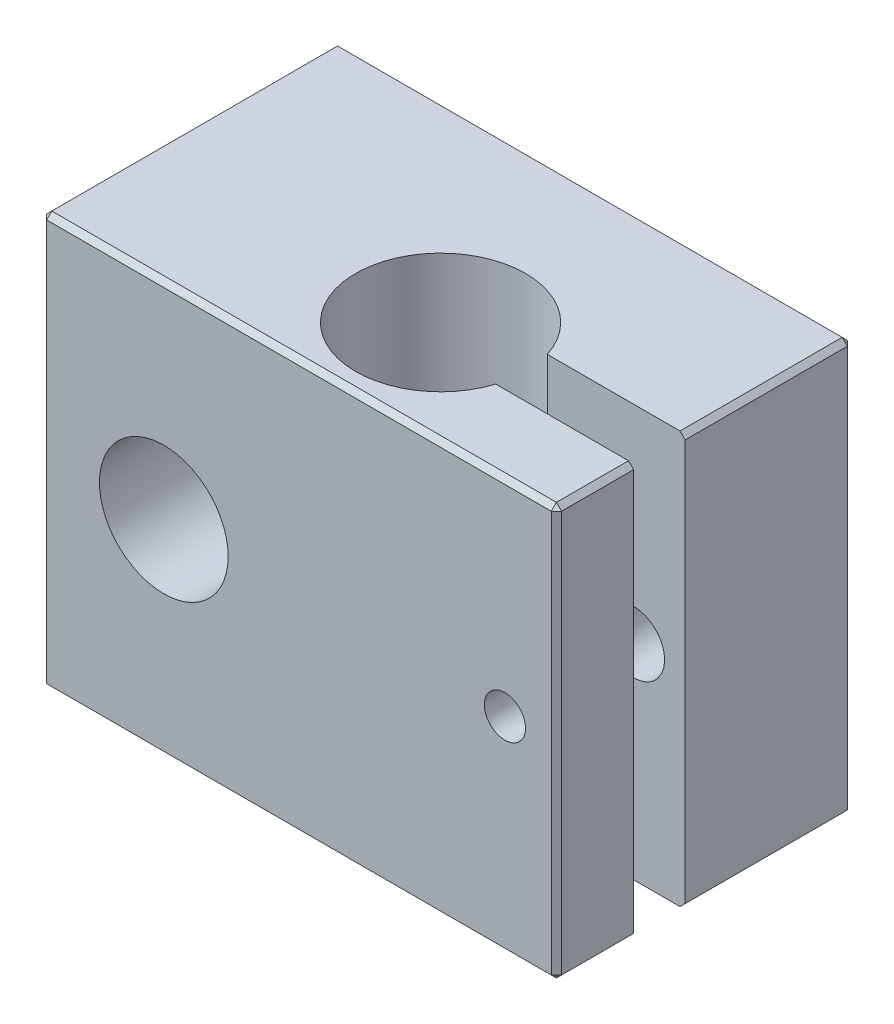
ISO-10303-21;
HEADER;
FILE_DESCRIPTION(('STEP AP214'),'2;1');
FILE_NAME('part.step','',(''),(''),'','','');
FILE_SCHEMA(('AUTOMOTIVE_DESIGN { 1 0 10303 214 1 1 1 1 }'));
ENDSEC;
DATA;
#1=APPLICATION_CONTEXT('core data for automotive mechanical design processes');
#2=APPLICATION_PROTOCOL_DEFINITION('international standard','automotive_design',2000,#1);
#3=PRODUCT_CONTEXT('',#1,'mechanical');
#4=PRODUCT('Part','Part','',(#3));
#5=PRODUCT_RELATED_PRODUCT_CATEGORY('part','',(#4));
#6=PRODUCT_DEFINITION_FORMATION('','',#4);
#7=PRODUCT_DEFINITION_CONTEXT('part definition',#1,'design');
#8=PRODUCT_DEFINITION('design','',#6,#7);
#9=PRODUCT_DEFINITION_SHAPE('','',#8);
#10=(LENGTH_UNIT() NAMED_UNIT(*) SI_UNIT(.MILLI.,.METRE.));
#11=(NAMED_UNIT(*) PLANE_ANGLE_UNIT() SI_UNIT($,.RADIAN.));
#12=(NAMED_UNIT(*) SI_UNIT($,.STERADIAN.) SOLID_ANGLE_UNIT());
#13=UNCERTAINTY_MEASURE_WITH_UNIT(LENGTH_MEASURE(1.E-05),#10,'distance_accuracy_value','');
#14=(GEOMETRIC_REPRESENTATION_CONTEXT(3) GLOBAL_UNCERTAINTY_ASSIGNED_CONTEXT((#13)) GLOBAL_UNIT_ASSIGNED_CONTEXT((#10,
#11,#12)) REPRESENTATION_CONTEXT('',''));
#15=CARTESIAN_POINT('',(0.,0.,0.));
#16=DIRECTION('',(0.,0.,1.));
#17=DIRECTION('',(1.,0.,0.));
#18=AXIS2_PLACEMENT_3D('',#15,#16,#17);
#19=CARTESIAN_POINT('',(0.,0.,0.));
#20=DIRECTION('',(0.,0.,1.));
#21=DIRECTION('',(1.,0.,0.));
#22=AXIS2_PLACEMENT_3D('',#19,#20,#21);
#23=PLANE('',#22);
#24=DIRECTION('',(0.,-1.,0.));
#25=VECTOR('',#24,1.);
#26=CARTESIAN_POINT('',(15.05,0.,0.));
#27=LINE('',#26,#25);
#28=CARTESIAN_POINT('',(15.05,7.8,0.));
#29=VERTEX_POINT('',#28);
#30=CARTESIAN_POINT('',(15.05,-7.8,0.));
#31=VERTEX_POINT('',#30);
#32=EDGE_CURVE('E239',#29,#31,#27,.T.);
#33=ORIENTED_EDGE('',*,*,#32,.T.);
#34=DIRECTION('',(-1.,0.,0.));
#35=VECTOR('',#34,1.);
#36=CARTESIAN_POINT('',(0.,-7.8,0.));
#37=LINE('',#36,#35);
#38=CARTESIAN_POINT('',(-4.55,-7.8,0.));
#39=VERTEX_POINT('',#38);
#40=EDGE_CURVE('E243',#31,#39,#37,.T.);
#41=ORIENTED_EDGE('',*,*,#40,.T.);
#42=DIRECTION('',(0.,1.,0.));
#43=VECTOR('',#42,1.);
#44=CARTESIAN_POINT('',(-4.55,0.,0.));
#45=LINE('',#44,#43);
#46=CARTESIAN_POINT('',(-4.55,7.8,0.));
#47=VERTEX_POINT('',#46);
#48=EDGE_CURVE('E241',#39,#47,#45,.T.);
#49=ORIENTED_EDGE('',*,*,#48,.T.);
#50=DIRECTION('',(1.,0.,0.));
#51=VECTOR('',#50,1.);
#52=CARTESIAN_POINT('',(0.,7.8,0.));
#53=LINE('',#52,#51);
#54=EDGE_CURVE('E237',#47,#29,#53,.T.);
#55=ORIENTED_EDGE('',*,*,#54,.T.);
#56=EDGE_LOOP('',(#33,#41,#49,#55));
#57=FACE_BOUND('',#56,.T.);
#58=CARTESIAN_POINT('',(0.,0.,0.));
#59=DIRECTION('',(0.,0.,1.));
#60=DIRECTION('',(1.,0.,0.));
#61=AXIS2_PLACEMENT_3D('',#58,#59,#60);
#62=CIRCLE('',#61,2.5);
#63=CARTESIAN_POINT('',(2.5,0.,0.));
#64=VERTEX_POINT('',#63);
#65=EDGE_CURVE('E179',#64,#64,#62,.T.);
#66=ORIENTED_EDGE('',*,*,#65,.T.);
#67=EDGE_LOOP('',(#66));
#68=FACE_BOUND('',#67,.T.);
#69=CARTESIAN_POINT('',(13.25,0.,0.));
#70=DIRECTION('',(0.,0.,-1.));
#71=DIRECTION('',(-1.,0.,0.));
#72=AXIS2_PLACEMENT_3D('',#69,#70,#71);
#73=CIRCLE('',#72,1.19999999999999);
#74=CARTESIAN_POINT('',(12.05,0.,0.));
#75=VERTEX_POINT('',#74);
#76=EDGE_CURVE('E355',#75,#75,#73,.T.);
#77=ORIENTED_EDGE('',*,*,#76,.F.);
#78=EDGE_LOOP('',(#77));
#79=FACE_BOUND('',#78,.T.);
#80=ADVANCED_FACE('F36',(#57,#68,#79),#23,.F.);
#81=CARTESIAN_POINT('',(15.25,8.,11.5));
#82=DIRECTION('',(-1.,0.,0.));
#83=DIRECTION('',(0.,-1.,0.));
#84=AXIS2_PLACEMENT_3D('',#81,#82,#83);
#85=PLANE('',#84);
#86=DIRECTION('',(0.,-1.,0.));
#87=VECTOR('',#86,1.);
#88=CARTESIAN_POINT('',(15.25,-8.,11.3));
#89=LINE('',#88,#87);
#90=CARTESIAN_POINT('',(15.25,7.8,11.3));
#91=VERTEX_POINT('',#90);
#92=CARTESIAN_POINT('',(15.25,-7.8,11.3));
#93=VERTEX_POINT('',#92);
#94=EDGE_CURVE('E275',#91,#93,#89,.T.);
#95=ORIENTED_EDGE('',*,*,#94,.T.);
#96=DIRECTION('',(0.,0.,-1.));
#97=VECTOR('',#96,1.);
#98=CARTESIAN_POINT('',(15.25,-7.8,11.5));
#99=LINE('',#98,#97);
#100=CARTESIAN_POINT('',(15.25,-7.8,8.5));
#101=VERTEX_POINT('',#100);
#102=EDGE_CURVE('E279',#93,#101,#99,.T.);
#103=ORIENTED_EDGE('',*,*,#102,.T.);
#104=DIRECTION('',(0.,1.,0.));
#105=VECTOR('',#104,1.);
#106=CARTESIAN_POINT('',(15.25,8.,8.5));
#107=LINE('',#106,#105);
#108=CARTESIAN_POINT('',(15.25,7.8,8.5));
#109=VERTEX_POINT('',#108);
#110=EDGE_CURVE('E196',#101,#109,#107,.T.);
#111=ORIENTED_EDGE('',*,*,#110,.T.);
#112=DIRECTION('',(0.,0.,1.));
#113=VECTOR('',#112,1.);
#114=CARTESIAN_POINT('',(15.25,7.8,11.5));
#115=LINE('',#114,#113);
#116=EDGE_CURVE('E277',#109,#91,#115,.T.);
#117=ORIENTED_EDGE('',*,*,#116,.T.);
#118=EDGE_LOOP('',(#95,#103,#111,#117));
#119=FACE_BOUND('',#118,.T.);
#120=ADVANCED_FACE('F485',(#119),#85,.F.);
#121=CARTESIAN_POINT('',(-4.75,8.,11.5));
#122=DIRECTION('',(1.,0.,0.));
#123=DIRECTION('',(0.,1.,0.));
#124=AXIS2_PLACEMENT_3D('',#121,#122,#123);
#125=PLANE('',#124);
#126=DIRECTION('',(0.,-1.,0.));
#127=VECTOR('',#126,1.);
#128=CARTESIAN_POINT('',(-4.75,8.,0.200000000000002));
#129=LINE('',#128,#127);
#130=CARTESIAN_POINT('',(-4.75,7.8,0.200000000000002));
#131=VERTEX_POINT('',#130);
#132=CARTESIAN_POINT('',(-4.75,-7.8,0.200000000000002));
#133=VERTEX_POINT('',#132);
#134=EDGE_CURVE('E250',#131,#133,#129,.T.);
#135=ORIENTED_EDGE('',*,*,#134,.T.);
#136=DIRECTION('',(0.,0.,1.));
#137=VECTOR('',#136,1.);
#138=CARTESIAN_POINT('',(-4.75,-7.8,11.5));
#139=LINE('',#138,#137);
#140=CARTESIAN_POINT('',(-4.75,-7.8,11.3));
#141=VERTEX_POINT('',#140);
#142=EDGE_CURVE('E252',#133,#141,#139,.T.);
#143=ORIENTED_EDGE('',*,*,#142,.T.);
#144=DIRECTION('',(0.,1.,0.));
#145=VECTOR('',#144,1.);
#146=CARTESIAN_POINT('',(-4.75,8.,11.3));
#147=LINE('',#146,#145);
#148=CARTESIAN_POINT('',(-4.75,7.8,11.3));
#149=VERTEX_POINT('',#148);
#150=EDGE_CURVE('E246',#141,#149,#147,.T.);
#151=ORIENTED_EDGE('',*,*,#150,.T.);
#152=DIRECTION('',(0.,0.,-1.));
#153=VECTOR('',#152,1.);
#154=CARTESIAN_POINT('',(-4.75,7.8,11.5));
#155=LINE('',#154,#153);
#156=EDGE_CURVE('E248',#149,#131,#155,.T.);
#157=ORIENTED_EDGE('',*,*,#156,.T.);
#158=EDGE_LOOP('',(#135,#143,#151,#157));
#159=FACE_BOUND('',#158,.T.);
#160=ADVANCED_FACE('F490',(#159),#125,.F.);
#161=CARTESIAN_POINT('',(-4.75,-8.,11.5));
#162=DIRECTION('',(0.,1.,0.));
#163=DIRECTION('',(0.,0.,1.));
#164=AXIS2_PLACEMENT_3D('',#161,#162,#163);
#165=PLANE('',#164);
#166=CARTESIAN_POINT('',(-1.25,-8.,6.5));
#167=DIRECTION('',(0.,-1.,0.));
#168=DIRECTION('',(0.,0.,-1.));
#169=AXIS2_PLACEMENT_3D('',#166,#167,#168);
#170=CIRCLE('',#169,1.025);
#171=CARTESIAN_POINT('',(-1.25,-8.,5.475));
#172=VERTEX_POINT('',#171);
#173=EDGE_CURVE('E198',#172,#172,#170,.T.);
#174=ORIENTED_EDGE('',*,*,#173,.F.);
#175=EDGE_LOOP('',(#174));
#176=FACE_BOUND('',#175,.T.);
#177=CARTESIAN_POINT('',(-2.25,-8.,9.));
#178=DIRECTION('',(0.,-1.,0.));
#179=DIRECTION('',(0.,0.,-1.));
#180=AXIS2_PLACEMENT_3D('',#177,#178,#179);
#181=CIRCLE('',#180,1.00000000000001);
#182=CARTESIAN_POINT('',(-2.25,-8.,7.99999999999998));
#183=VERTEX_POINT('',#182);
#184=EDGE_CURVE('E210',#183,#183,#181,.T.);
#185=ORIENTED_EDGE('',*,*,#184,.F.);
#186=EDGE_LOOP('',(#185));
#187=FACE_BOUND('',#186,.T.);
#188=DIRECTION('',(1.,0.,0.));
#189=VECTOR('',#188,1.);
#190=CARTESIAN_POINT('',(-4.75,-8.,0.200000000000002));
#191=LINE('',#190,#189);
#192=CARTESIAN_POINT('',(-4.55,-8.,0.200000000000002));
#193=VERTEX_POINT('',#192);
#194=CARTESIAN_POINT('',(15.05,-8.,0.200000000000002));
#195=VERTEX_POINT('',#194);
#196=EDGE_CURVE('E234',#193,#195,#191,.T.);
#197=ORIENTED_EDGE('',*,*,#196,.T.);
#198=DIRECTION('',(0.,0.,1.));
#199=VECTOR('',#198,1.);
#200=CARTESIAN_POINT('',(15.05,-8.,11.5));
#201=LINE('',#200,#199);
#202=CARTESIAN_POINT('',(15.05,-8.,6.5));
#203=VERTEX_POINT('',#202);
#204=EDGE_CURVE('E188',#195,#203,#201,.T.);
#205=ORIENTED_EDGE('',*,*,#204,.T.);
#206=DIRECTION('',(1.,0.,0.));
#207=VECTOR('',#206,1.);
#208=CARTESIAN_POINT('',(6.75,-8.,6.5));
#209=LINE('',#208,#207);
#210=CARTESIAN_POINT('',(9.89483703870327,-8.,6.5));
#211=VERTEX_POINT('',#210);
#212=EDGE_CURVE('E170',#211,#203,#209,.T.);
#213=ORIENTED_EDGE('',*,*,#212,.F.);
#214=CARTESIAN_POINT('',(6.75,-8.,7.5));
#215=DIRECTION('',(0.,-1.,0.));
#216=DIRECTION('',(0.,0.,-1.));
#217=AXIS2_PLACEMENT_3D('',#214,#215,#216);
#218=CIRCLE('',#217,3.29999999999999);
#219=CARTESIAN_POINT('',(9.89483703870327,-8.,8.5));
#220=VERTEX_POINT('',#219);
#221=EDGE_CURVE('E186',#220,#211,#218,.T.);
#222=ORIENTED_EDGE('',*,*,#221,.F.);
#223=DIRECTION('',(-1.,0.,0.));
#224=VECTOR('',#223,1.);
#225=CARTESIAN_POINT('',(6.75,-8.,8.5));
#226=LINE('',#225,#224);
#227=CARTESIAN_POINT('',(15.05,-8.,8.5));
#228=VERTEX_POINT('',#227);
#229=EDGE_CURVE('E189',#228,#220,#226,.T.);
#230=ORIENTED_EDGE('',*,*,#229,.F.);
#231=DIRECTION('',(0.,0.,1.));
#232=VECTOR('',#231,1.);
#233=CARTESIAN_POINT('',(15.05,-8.,11.5));
#234=LINE('',#233,#232);
#235=CARTESIAN_POINT('',(15.05,-8.,11.3));
#236=VERTEX_POINT('',#235);
#237=EDGE_CURVE('E230',#228,#236,#234,.T.);
#238=ORIENTED_EDGE('',*,*,#237,.T.);
#239=DIRECTION('',(-1.,0.,0.));
#240=VECTOR('',#239,1.);
#241=CARTESIAN_POINT('',(-4.75,-8.,11.3));
#242=LINE('',#241,#240);
#243=CARTESIAN_POINT('',(-4.55,-8.,11.3));
#244=VERTEX_POINT('',#243);
#245=EDGE_CURVE('E228',#236,#244,#242,.T.);
#246=ORIENTED_EDGE('',*,*,#245,.T.);
#247=DIRECTION('',(0.,0.,-1.));
#248=VECTOR('',#247,1.);
#249=CARTESIAN_POINT('',(-4.55,-8.,11.5));
#250=LINE('',#249,#248);
#251=EDGE_CURVE('E232',#244,#193,#250,.T.);
#252=ORIENTED_EDGE('',*,*,#251,.T.);
#253=EDGE_LOOP('',(#197,#205,#213,#222,#230,#238,#246,#252));
#254=FACE_BOUND('',#253,.T.);
#255=ADVANCED_FACE('F184',(#176,#187,#254),#165,.F.);
#256=DIRECTION('',(0.,-1.,0.));
#257=VECTOR('',#256,1.);
#258=CARTESIAN_POINT('',(15.25,8.,6.5));
#259=LINE('',#258,#257);
#260=CARTESIAN_POINT('',(15.25,7.8,6.5));
#261=VERTEX_POINT('',#260);
#262=CARTESIAN_POINT('',(15.25,-7.8,6.5));
#263=VERTEX_POINT('',#262);
#264=EDGE_CURVE('E201',#261,#263,#259,.T.);
#265=ORIENTED_EDGE('',*,*,#264,.T.);
#266=DIRECTION('',(0.,0.,-1.));
#267=VECTOR('',#266,1.);
#268=CARTESIAN_POINT('',(15.25,-7.8,11.5));
#269=LINE('',#268,#267);
#270=CARTESIAN_POINT('',(15.25,-7.8,0.200000000000002));
#271=VERTEX_POINT('',#270);
#272=EDGE_CURVE('E259',#263,#271,#269,.T.);
#273=ORIENTED_EDGE('',*,*,#272,.T.);
#274=DIRECTION('',(0.,1.,0.));
#275=VECTOR('',#274,1.);
#276=CARTESIAN_POINT('',(15.25,8.,0.200000000000002));
#277=LINE('',#276,#275);
#278=CARTESIAN_POINT('',(15.25,7.8,0.200000000000002));
#279=VERTEX_POINT('',#278);
#280=EDGE_CURVE('E257',#271,#279,#277,.T.);
#281=ORIENTED_EDGE('',*,*,#280,.T.);
#282=DIRECTION('',(0.,0.,1.));
#283=VECTOR('',#282,1.);
#284=CARTESIAN_POINT('',(15.25,7.8,11.5));
#285=LINE('',#284,#283);
#286=EDGE_CURVE('E255',#279,#261,#285,.T.);
#287=ORIENTED_EDGE('',*,*,#286,.T.);
#288=EDGE_LOOP('',(#265,#273,#281,#287));
#289=FACE_BOUND('',#288,.T.);
#290=ADVANCED_FACE('F379',(#289),#85,.F.);
#291=CARTESIAN_POINT('',(-4.75,8.,11.5));
#292=DIRECTION('',(0.,-1.,0.));
#293=DIRECTION('',(0.,0.,-1.));
#294=AXIS2_PLACEMENT_3D('',#291,#292,#293);
#295=PLANE('',#294);
#296=DIRECTION('',(1.,0.,0.));
#297=VECTOR('',#296,1.);
#298=CARTESIAN_POINT('',(6.75,8.,6.5));
#299=LINE('',#298,#297);
#300=CARTESIAN_POINT('',(9.89483703870327,8.,6.5));
#301=VERTEX_POINT('',#300);
#302=CARTESIAN_POINT('',(15.05,8.,6.5));
#303=VERTEX_POINT('',#302);
#304=EDGE_CURVE('E173',#301,#303,#299,.T.);
#305=ORIENTED_EDGE('',*,*,#304,.T.);
#306=DIRECTION('',(0.,0.,-1.));
#307=VECTOR('',#306,1.);
#308=CARTESIAN_POINT('',(15.05,8.,11.5));
#309=LINE('',#308,#307);
#310=CARTESIAN_POINT('',(15.05,8.,0.200000000000002));
#311=VERTEX_POINT('',#310);
#312=EDGE_CURVE('E273',#303,#311,#309,.T.);
#313=ORIENTED_EDGE('',*,*,#312,.T.);
#314=DIRECTION('',(-1.,0.,0.));
#315=VECTOR('',#314,1.);
#316=CARTESIAN_POINT('',(-4.75,8.,0.200000000000002));
#317=LINE('',#316,#315);
#318=CARTESIAN_POINT('',(-4.55,8.,0.200000000000002));
#319=VERTEX_POINT('',#318);
#320=EDGE_CURVE('E271',#311,#319,#317,.T.);
#321=ORIENTED_EDGE('',*,*,#320,.T.);
#322=DIRECTION('',(0.,0.,1.));
#323=VECTOR('',#322,1.);
#324=CARTESIAN_POINT('',(-4.55,8.,11.5));
#325=LINE('',#324,#323);
#326=CARTESIAN_POINT('',(-4.55,8.,11.3));
#327=VERTEX_POINT('',#326);
#328=EDGE_CURVE('E269',#319,#327,#325,.T.);
#329=ORIENTED_EDGE('',*,*,#328,.T.);
#330=DIRECTION('',(1.,0.,0.));
#331=VECTOR('',#330,1.);
#332=CARTESIAN_POINT('',(15.25,8.,11.3));
#333=LINE('',#332,#331);
#334=CARTESIAN_POINT('',(15.05,8.,11.3));
#335=VERTEX_POINT('',#334);
#336=EDGE_CURVE('E265',#327,#335,#333,.T.);
#337=ORIENTED_EDGE('',*,*,#336,.T.);
#338=DIRECTION('',(0.,0.,-1.));
#339=VECTOR('',#338,1.);
#340=CARTESIAN_POINT('',(15.05,8.,11.5));
#341=LINE('',#340,#339);
#342=CARTESIAN_POINT('',(15.05,8.,8.5));
#343=VERTEX_POINT('',#342);
#344=EDGE_CURVE('E267',#335,#343,#341,.T.);
#345=ORIENTED_EDGE('',*,*,#344,.T.);
#346=DIRECTION('',(-1.,0.,0.));
#347=VECTOR('',#346,1.);
#348=CARTESIAN_POINT('',(6.75,8.,8.5));
#349=LINE('',#348,#347);
#350=CARTESIAN_POINT('',(9.89483703870327,8.,8.5));
#351=VERTEX_POINT('',#350);
#352=EDGE_CURVE('E373',#343,#351,#349,.T.);
#353=ORIENTED_EDGE('',*,*,#352,.T.);
#354=CARTESIAN_POINT('',(6.75,8.,7.5));
#355=DIRECTION('',(0.,-1.,0.));
#356=DIRECTION('',(0.,0.,-1.));
#357=AXIS2_PLACEMENT_3D('',#354,#355,#356);
#358=CIRCLE('',#357,3.3);
#359=EDGE_CURVE('E195',#351,#301,#358,.T.);
#360=ORIENTED_EDGE('',*,*,#359,.T.);
#361=EDGE_LOOP('',(#305,#313,#321,#329,#337,#345,#353,#360));
#362=FACE_BOUND('',#361,.T.);
#363=ADVANCED_FACE('F415',(#362),#295,.F.);
#364=CARTESIAN_POINT('',(0.,0.,11.5));
#365=DIRECTION('',(0.,0.,1.));
#366=DIRECTION('',(1.,0.,0.));
#367=AXIS2_PLACEMENT_3D('',#364,#365,#366);
#368=PLANE('',#367);
#369=DIRECTION('',(0.,-1.,0.));
#370=VECTOR('',#369,1.);
#371=CARTESIAN_POINT('',(-4.55,-8.,11.5));
#372=LINE('',#371,#370);
#373=CARTESIAN_POINT('',(-4.55,7.8,11.5));
#374=VERTEX_POINT('',#373);
#375=CARTESIAN_POINT('',(-4.55,-7.8,11.5));
#376=VERTEX_POINT('',#375);
#377=EDGE_CURVE('E285',#374,#376,#372,.T.);
#378=ORIENTED_EDGE('',*,*,#377,.T.);
#379=DIRECTION('',(1.,0.,0.));
#380=VECTOR('',#379,1.);
#381=CARTESIAN_POINT('',(15.25,-7.8,11.5));
#382=LINE('',#381,#380);
#383=CARTESIAN_POINT('',(15.05,-7.8,11.5));
#384=VERTEX_POINT('',#383);
#385=EDGE_CURVE('E11',#376,#384,#382,.T.);
#386=ORIENTED_EDGE('',*,*,#385,.T.);
#387=DIRECTION('',(0.,1.,0.));
#388=VECTOR('',#387,1.);
#389=CARTESIAN_POINT('',(15.05,8.,11.5));
#390=LINE('',#389,#388);
#391=CARTESIAN_POINT('',(15.05,7.8,11.5));
#392=VERTEX_POINT('',#391);
#393=EDGE_CURVE('E45',#384,#392,#390,.T.);
#394=ORIENTED_EDGE('',*,*,#393,.T.);
#395=DIRECTION('',(-1.,0.,0.));
#396=VECTOR('',#395,1.);
#397=CARTESIAN_POINT('',(-4.75,7.8,11.5));
#398=LINE('',#397,#396);
#399=EDGE_CURVE('E287',#392,#374,#398,.T.);
#400=ORIENTED_EDGE('',*,*,#399,.T.);
#401=EDGE_LOOP('',(#378,#386,#394,#400));
#402=FACE_BOUND('',#401,.T.);
#403=CARTESIAN_POINT('',(13.25,0.,11.5));
#404=DIRECTION('',(0.,0.,1.));
#405=DIRECTION('',(1.,0.,0.));
#406=AXIS2_PLACEMENT_3D('',#403,#404,#405);
#407=CIRCLE('',#406,0.799999999999988);
#408=CARTESIAN_POINT('',(14.05,0.,11.5));
#409=VERTEX_POINT('',#408);
#410=EDGE_CURVE('E365',#409,#409,#407,.T.);
#411=ORIENTED_EDGE('',*,*,#410,.F.);
#412=EDGE_LOOP('',(#411));
#413=FACE_BOUND('',#412,.T.);
#414=CARTESIAN_POINT('',(0.,0.,11.5));
#415=DIRECTION('',(0.,0.,1.));
#416=DIRECTION('',(1.,0.,0.));
#417=AXIS2_PLACEMENT_3D('',#414,#415,#416);
#418=CIRCLE('',#417,2.49999999999999);
#419=CARTESIAN_POINT('',(2.49999999999999,0.,11.5));
#420=VERTEX_POINT('',#419);
#421=EDGE_CURVE('E222',#420,#420,#418,.T.);
#422=ORIENTED_EDGE('',*,*,#421,.F.);
#423=EDGE_LOOP('',(#422));
#424=FACE_BOUND('',#423,.T.);
#425=ADVANCED_FACE('F464',(#402,#413,#424),#368,.T.);
#426=CARTESIAN_POINT('',(0.,0.,11.5));
#427=DIRECTION('',(0.,0.,1.));
#428=DIRECTION('',(1.,0.,0.));
#429=AXIS2_PLACEMENT_3D('',#426,#427,#428);
#430=CYLINDRICAL_SURFACE('',#429,2.49999999999999);
#431=ORIENTED_EDGE('',*,*,#65,.F.);
#432=EDGE_LOOP('',(#431));
#433=FACE_BOUND('',#432,.T.);
#434=ORIENTED_EDGE('',*,*,#421,.T.);
#435=EDGE_LOOP('',(#434));
#436=FACE_BOUND('',#435,.T.);
#437=ADVANCED_FACE('F467',(#433,#436),#430,.F.);
#438=CARTESIAN_POINT('',(-2.25,-3.5,9.));
#439=DIRECTION('',(0.,1.,0.));
#440=DIRECTION('',(0.,0.,1.));
#441=AXIS2_PLACEMENT_3D('',#438,#439,#440);
#442=PLANE('',#441);
#443=CARTESIAN_POINT('',(-2.25,-3.5,9.));
#444=DIRECTION('',(0.,-1.,0.));
#445=DIRECTION('',(0.,0.,-1.));
#446=AXIS2_PLACEMENT_3D('',#443,#444,#445);
#447=CIRCLE('',#446,0.500000000000013);
#448=CARTESIAN_POINT('',(-2.25,-3.5,8.49999999999999));
#449=VERTEX_POINT('',#448);
#450=EDGE_CURVE('E219',#449,#449,#447,.T.);
#451=ORIENTED_EDGE('',*,*,#450,.T.);
#452=EDGE_LOOP('',(#451));
#453=FACE_BOUND('',#452,.T.);
#454=ADVANCED_FACE('F474',(#453),#442,.F.);
#455=CARTESIAN_POINT('',(-2.25,-8.,9.));
#456=DIRECTION('',(0.,-1.,0.));
#457=DIRECTION('',(0.,0.,-1.));
#458=AXIS2_PLACEMENT_3D('',#455,#456,#457);
#459=CYLINDRICAL_SURFACE('',#458,0.500000000000013);
#460=ORIENTED_EDGE('',*,*,#450,.F.);
#461=EDGE_LOOP('',(#460));
#462=FACE_BOUND('',#461,.T.);
#463=CARTESIAN_POINT('',(-2.25,-6.,9.));
#464=DIRECTION('',(0.,-1.,0.));
#465=DIRECTION('',(0.,0.,-1.));
#466=AXIS2_PLACEMENT_3D('',#463,#464,#465);
#467=CIRCLE('',#466,0.500000000000013);
#468=CARTESIAN_POINT('',(-2.25,-6.,8.49999999999999));
#469=VERTEX_POINT('',#468);
#470=EDGE_CURVE('E216',#469,#469,#467,.T.);
#471=ORIENTED_EDGE('',*,*,#470,.T.);
#472=EDGE_LOOP('',(#471));
#473=FACE_BOUND('',#472,.T.);
#474=ADVANCED_FACE('F480',(#462,#473),#459,.F.);
#475=CARTESIAN_POINT('',(-1.74999999999999,-6.,9.));
#476=DIRECTION('',(0.,1.,0.));
#477=DIRECTION('',(0.,0.,1.));
#478=AXIS2_PLACEMENT_3D('',#475,#476,#477);
#479=PLANE('',#478);
#480=ORIENTED_EDGE('',*,*,#470,.F.);
#481=EDGE_LOOP('',(#480));
#482=FACE_BOUND('',#481,.T.);
#483=CARTESIAN_POINT('',(-2.25,-6.,9.));
#484=DIRECTION('',(0.,-1.,0.));
#485=DIRECTION('',(0.,0.,-1.));
#486=AXIS2_PLACEMENT_3D('',#483,#484,#485);
#487=CIRCLE('',#486,1.00000000000001);
#488=CARTESIAN_POINT('',(-2.25,-6.,7.99999999999999));
#489=VERTEX_POINT('',#488);
#490=EDGE_CURVE('E213',#489,#489,#487,.T.);
#491=ORIENTED_EDGE('',*,*,#490,.T.);
#492=EDGE_LOOP('',(#491));
#493=FACE_BOUND('',#492,.T.);
#494=ADVANCED_FACE('F587',(#482,#493),#479,.F.);
#495=CARTESIAN_POINT('',(-2.25,-8.,9.));
#496=DIRECTION('',(0.,-1.,0.));
#497=DIRECTION('',(0.,0.,-1.));
#498=AXIS2_PLACEMENT_3D('',#495,#496,#497);
#499=CYLINDRICAL_SURFACE('',#498,1.00000000000001);
#500=ORIENTED_EDGE('',*,*,#490,.F.);
#501=EDGE_LOOP('',(#500));
#502=FACE_BOUND('',#501,.T.);
#503=ORIENTED_EDGE('',*,*,#184,.T.);
#504=EDGE_LOOP('',(#503));
#505=FACE_BOUND('',#504,.T.);
#506=ADVANCED_FACE('F583',(#502,#505),#499,.F.);
#507=CARTESIAN_POINT('',(-1.25,-3.5,6.5));
#508=DIRECTION('',(0.,-1.,0.));
#509=DIRECTION('',(0.,0.,-1.));
#510=AXIS2_PLACEMENT_3D('',#507,#508,#509);
#511=CONICAL_SURFACE('',#510,1.025,1.02974425867665);
#512=CARTESIAN_POINT('',(-1.25,-2.88411786549675,6.5));
#513=VERTEX_POINT('',#512);
#514=VERTEX_LOOP('',#513);
#515=FACE_BOUND('',#514,.T.);
#516=CARTESIAN_POINT('',(-1.25,-3.5,6.5));
#517=DIRECTION('',(0.,-1.,0.));
#518=DIRECTION('',(0.,0.,-1.));
#519=AXIS2_PLACEMENT_3D('',#516,#517,#518);
#520=CIRCLE('',#519,1.025);
#521=CARTESIAN_POINT('',(-1.25,-3.5,5.475));
#522=VERTEX_POINT('',#521);
#523=EDGE_CURVE('E207',#522,#522,#520,.T.);
#524=ORIENTED_EDGE('',*,*,#523,.T.);
#525=EDGE_LOOP('',(#524));
#526=FACE_BOUND('',#525,.T.);
#527=ADVANCED_FACE('F579',(#515,#526),#511,.F.);
#528=CARTESIAN_POINT('',(-1.25,-8.,6.5));
#529=DIRECTION('',(0.,-1.,0.));
#530=DIRECTION('',(0.,0.,-1.));
#531=AXIS2_PLACEMENT_3D('',#528,#529,#530);
#532=CYLINDRICAL_SURFACE('',#531,1.025);
#533=ORIENTED_EDGE('',*,*,#523,.F.);
#534=EDGE_LOOP('',(#533));
#535=FACE_BOUND('',#534,.T.);
#536=ORIENTED_EDGE('',*,*,#173,.T.);
#537=EDGE_LOOP('',(#536));
#538=FACE_BOUND('',#537,.T.);
#539=ADVANCED_FACE('F576',(#535,#538),#532,.F.);
#540=CARTESIAN_POINT('',(6.75,-8.,7.5));
#541=DIRECTION('',(0.,-1.,0.));
#542=DIRECTION('',(0.,0.,-1.));
#543=AXIS2_PLACEMENT_3D('',#540,#541,#542);
#544=CYLINDRICAL_SURFACE('',#543,3.29999999999999);
#545=ORIENTED_EDGE('',*,*,#359,.F.);
#546=DIRECTION('',(0.,-1.,0.));
#547=VECTOR('',#546,1.);
#548=CARTESIAN_POINT('',(9.89483703870327,-8.,8.5));
#549=LINE('',#548,#547);
#550=EDGE_CURVE('E178',#351,#220,#549,.T.);
#551=ORIENTED_EDGE('',*,*,#550,.T.);
#552=ORIENTED_EDGE('',*,*,#221,.T.);
#553=DIRECTION('',(0.,-1.,0.));
#554=VECTOR('',#553,1.);
#555=CARTESIAN_POINT('',(9.89483703870327,-8.,6.5));
#556=LINE('',#555,#554);
#557=EDGE_CURVE('E167',#211,#301,#556,.F.);
#558=ORIENTED_EDGE('',*,*,#557,.T.);
#559=EDGE_LOOP('',(#545,#551,#552,#558));
#560=FACE_BOUND('',#559,.T.);
#561=ADVANCED_FACE('F193',(#560),#544,.F.);
#562=CARTESIAN_POINT('',(6.75,8.,6.5));
#563=DIRECTION('',(0.,0.,-1.));
#564=DIRECTION('',(-1.,0.,0.));
#565=AXIS2_PLACEMENT_3D('',#562,#563,#564);
#566=PLANE('',#565);
#567=CARTESIAN_POINT('',(13.25,0.,6.5));
#568=DIRECTION('',(0.,0.,-1.));
#569=DIRECTION('',(-1.,0.,0.));
#570=AXIS2_PLACEMENT_3D('',#567,#568,#569);
#571=CIRCLE('',#570,1.19999999999999);
#572=CARTESIAN_POINT('',(12.05,0.,6.5));
#573=VERTEX_POINT('',#572);
#574=EDGE_CURVE('E360',#573,#573,#571,.T.);
#575=ORIENTED_EDGE('',*,*,#574,.T.);
#576=EDGE_LOOP('',(#575));
#577=FACE_BOUND('',#576,.T.);
#578=ORIENTED_EDGE('',*,*,#212,.T.);
#579=DIRECTION('',(-0.707106781186548,-0.707106781186548,0.));
#580=VECTOR('',#579,1.);
#581=CARTESIAN_POINT('',(15.25,-7.8,6.5));
#582=LINE('',#581,#580);
#583=EDGE_CURVE('E263',#203,#263,#582,.F.);
#584=ORIENTED_EDGE('',*,*,#583,.T.);
#585=ORIENTED_EDGE('',*,*,#264,.F.);
#586=DIRECTION('',(0.707106781186548,-0.707106781186548,0.));
#587=VECTOR('',#586,1.);
#588=CARTESIAN_POINT('',(15.05,8.,6.5));
#589=LINE('',#588,#587);
#590=EDGE_CURVE('E261',#261,#303,#589,.F.);
#591=ORIENTED_EDGE('',*,*,#590,.T.);
#592=ORIENTED_EDGE('',*,*,#304,.F.);
#593=ORIENTED_EDGE('',*,*,#557,.F.);
#594=EDGE_LOOP('',(#578,#584,#585,#591,#592,#593));
#595=FACE_BOUND('',#594,.T.);
#596=ADVANCED_FACE('F169',(#577,#595),#566,.F.);
#597=CARTESIAN_POINT('',(6.75,8.,8.5));
#598=DIRECTION('',(0.,0.,1.));
#599=DIRECTION('',(1.,0.,0.));
#600=AXIS2_PLACEMENT_3D('',#597,#598,#599);
#601=PLANE('',#600);
#602=CARTESIAN_POINT('',(13.25,0.,8.5));
#603=DIRECTION('',(0.,0.,1.));
#604=DIRECTION('',(1.,0.,0.));
#605=AXIS2_PLACEMENT_3D('',#602,#603,#604);
#606=CIRCLE('',#605,0.799999999999993);
#607=CARTESIAN_POINT('',(14.05,0.,8.5));
#608=VERTEX_POINT('',#607);
#609=EDGE_CURVE('E190',#608,#608,#606,.T.);
#610=ORIENTED_EDGE('',*,*,#609,.T.);
#611=EDGE_LOOP('',(#610));
#612=FACE_BOUND('',#611,.T.);
#613=ORIENTED_EDGE('',*,*,#110,.F.);
#614=DIRECTION('',(0.707106781186548,0.707106781186548,0.));
#615=VECTOR('',#614,1.);
#616=CARTESIAN_POINT('',(15.25,-7.8,8.5));
#617=LINE('',#616,#615);
#618=EDGE_CURVE('E283',#101,#228,#617,.F.);
#619=ORIENTED_EDGE('',*,*,#618,.T.);
#620=ORIENTED_EDGE('',*,*,#229,.T.);
#621=ORIENTED_EDGE('',*,*,#550,.F.);
#622=ORIENTED_EDGE('',*,*,#352,.F.);
#623=DIRECTION('',(-0.707106781186548,0.707106781186548,0.));
#624=VECTOR('',#623,1.);
#625=CARTESIAN_POINT('',(15.05,8.,8.5));
#626=LINE('',#625,#624);
#627=EDGE_CURVE('E281',#343,#109,#626,.F.);
#628=ORIENTED_EDGE('',*,*,#627,.T.);
#629=EDGE_LOOP('',(#613,#619,#620,#621,#622,#628));
#630=FACE_BOUND('',#629,.T.);
#631=ADVANCED_FACE('F421',(#612,#630),#601,.F.);
#632=CARTESIAN_POINT('',(13.25,0.,11.5));
#633=DIRECTION('',(0.,0.,1.));
#634=DIRECTION('',(1.,0.,0.));
#635=AXIS2_PLACEMENT_3D('',#632,#633,#634);
#636=CYLINDRICAL_SURFACE('',#635,0.799999999999993);
#637=ORIENTED_EDGE('',*,*,#609,.F.);
#638=EDGE_LOOP('',(#637));
#639=FACE_BOUND('',#638,.T.);
#640=ORIENTED_EDGE('',*,*,#410,.T.);
#641=EDGE_LOOP('',(#640));
#642=FACE_BOUND('',#641,.T.);
#643=ADVANCED_FACE('F558',(#639,#642),#636,.F.);
#644=CARTESIAN_POINT('',(13.25,0.,0.));
#645=DIRECTION('',(0.,0.,-1.));
#646=DIRECTION('',(-1.,0.,0.));
#647=AXIS2_PLACEMENT_3D('',#644,#645,#646);
#648=CYLINDRICAL_SURFACE('',#647,1.19999999999999);
#649=ORIENTED_EDGE('',*,*,#574,.F.);
#650=EDGE_LOOP('',(#649));
#651=FACE_BOUND('',#650,.T.);
#652=ORIENTED_EDGE('',*,*,#76,.T.);
#653=EDGE_LOOP('',(#652));
#654=FACE_BOUND('',#653,.T.);
#655=ADVANCED_FACE('F551',(#651,#654),#648,.F.);
#656=CARTESIAN_POINT('',(15.05,8.,11.5));
#657=DIRECTION('',(-0.707106781186547,-0.707106781186547,0.));
#658=DIRECTION('',(0.,0.,-1.));
#659=AXIS2_PLACEMENT_3D('',#656,#657,#658);
#660=PLANE('',#659);
#661=DIRECTION('',(0.707106781186547,-0.707106781186547,0.));
#662=VECTOR('',#661,1.);
#663=CARTESIAN_POINT('',(15.25,7.8,11.3));
#664=LINE('',#663,#662);
#665=EDGE_CURVE('E40',#91,#335,#664,.F.);
#666=ORIENTED_EDGE('',*,*,#665,.F.);
#667=ORIENTED_EDGE('',*,*,#116,.F.);
#668=ORIENTED_EDGE('',*,*,#627,.F.);
#669=ORIENTED_EDGE('',*,*,#344,.F.);
#670=EDGE_LOOP('',(#666,#667,#668,#669));
#671=FACE_BOUND('',#670,.T.);
#672=ADVANCED_FACE('F38',(#671),#660,.F.);
#673=CARTESIAN_POINT('',(15.25,7.8,11.3));
#674=DIRECTION('',(0.577350269189627,0.577350269189627,0.577350269189623));
#675=DIRECTION('',(-0.707106781186548,0.707106781186548,0.));
#676=AXIS2_PLACEMENT_3D('',#673,#674,#675);
#677=PLANE('',#676);
#678=DIRECTION('',(0.707106781186546,0.,-0.707106781186549));
#679=VECTOR('',#678,1.);
#680=CARTESIAN_POINT('',(15.25,7.8,11.3));
#681=LINE('',#680,#679);
#682=EDGE_CURVE('E347',#91,#392,#681,.F.);
#683=ORIENTED_EDGE('',*,*,#682,.F.);
#684=ORIENTED_EDGE('',*,*,#665,.T.);
#685=DIRECTION('',(0.,-0.707106781186548,0.707106781186548));
#686=VECTOR('',#685,1.);
#687=CARTESIAN_POINT('',(15.05,7.9,11.4));
#688=LINE('',#687,#686);
#689=EDGE_CURVE('E348',#392,#335,#688,.F.);
#690=ORIENTED_EDGE('',*,*,#689,.F.);
#691=EDGE_LOOP('',(#683,#684,#690));
#692=FACE_BOUND('',#691,.T.);
#693=ADVANCED_FACE('F546',(#692),#677,.T.);
#694=CARTESIAN_POINT('',(0.,7.8,11.5));
#695=DIRECTION('',(0.,0.707106781186547,0.707106781186547));
#696=DIRECTION('',(1.,0.,0.));
#697=AXIS2_PLACEMENT_3D('',#694,#695,#696);
#698=PLANE('',#697);
#699=ORIENTED_EDGE('',*,*,#689,.T.);
#700=ORIENTED_EDGE('',*,*,#336,.F.);
#701=DIRECTION('',(0.,0.707106781186548,-0.707106781186548));
#702=VECTOR('',#701,1.);
#703=CARTESIAN_POINT('',(-4.55,8.,11.3));
#704=LINE('',#703,#702);
#705=EDGE_CURVE('E344',#374,#327,#704,.T.);
#706=ORIENTED_EDGE('',*,*,#705,.F.);
#707=ORIENTED_EDGE('',*,*,#399,.F.);
#708=EDGE_LOOP('',(#699,#700,#706,#707));
#709=FACE_BOUND('',#708,.T.);
#710=ADVANCED_FACE('F455',(#709),#698,.T.);
#711=CARTESIAN_POINT('',(15.05,0.,11.5));
#712=DIRECTION('',(0.707106781186549,0.,0.707106781186546));
#713=DIRECTION('',(0.,-1.,0.));
#714=AXIS2_PLACEMENT_3D('',#711,#712,#713);
#715=PLANE('',#714);
#716=ORIENTED_EDGE('',*,*,#682,.T.);
#717=ORIENTED_EDGE('',*,*,#393,.F.);
#718=DIRECTION('',(-0.707106781186546,0.,0.707106781186549));
#719=VECTOR('',#718,1.);
#720=CARTESIAN_POINT('',(15.15,-7.8,11.4));
#721=LINE('',#720,#719);
#722=EDGE_CURVE('E342',#93,#384,#721,.T.);
#723=ORIENTED_EDGE('',*,*,#722,.F.);
#724=ORIENTED_EDGE('',*,*,#94,.F.);
#725=EDGE_LOOP('',(#716,#717,#723,#724));
#726=FACE_BOUND('',#725,.T.);
#727=ADVANCED_FACE('F541',(#726),#715,.T.);
#728=CARTESIAN_POINT('',(15.25,-7.8,11.5));
#729=DIRECTION('',(-0.707106781186547,0.707106781186547,0.));
#730=DIRECTION('',(0.,0.,-1.));
#731=AXIS2_PLACEMENT_3D('',#728,#729,#730);
#732=PLANE('',#731);
#733=ORIENTED_EDGE('',*,*,#618,.F.);
#734=ORIENTED_EDGE('',*,*,#102,.F.);
#735=DIRECTION('',(-0.707106781186547,-0.707106781186547,0.));
#736=VECTOR('',#735,1.);
#737=CARTESIAN_POINT('',(15.05,-8.,11.3));
#738=LINE('',#737,#736);
#739=EDGE_CURVE('E339',#236,#93,#738,.F.);
#740=ORIENTED_EDGE('',*,*,#739,.F.);
#741=ORIENTED_EDGE('',*,*,#237,.F.);
#742=EDGE_LOOP('',(#733,#734,#740,#741));
#743=FACE_BOUND('',#742,.T.);
#744=ADVANCED_FACE('F426',(#743),#732,.F.);
#745=CARTESIAN_POINT('',(-4.55,8.,11.3));
#746=DIRECTION('',(-0.577350269189626,0.577350269189626,0.577350269189626));
#747=DIRECTION('',(0.707106781186548,0.,0.707106781186548));
#748=AXIS2_PLACEMENT_3D('',#745,#746,#747);
#749=PLANE('',#748);
#750=DIRECTION('',(0.707106781186547,0.,0.707106781186547));
#751=VECTOR('',#750,1.);
#752=CARTESIAN_POINT('',(-4.65,7.8,11.4));
#753=LINE('',#752,#751);
#754=EDGE_CURVE('E333',#374,#149,#753,.F.);
#755=ORIENTED_EDGE('',*,*,#754,.F.);
#756=ORIENTED_EDGE('',*,*,#705,.T.);
#757=DIRECTION('',(0.707106781186548,0.707106781186548,0.));
#758=VECTOR('',#757,1.);
#759=CARTESIAN_POINT('',(-4.55,8.,11.3));
#760=LINE('',#759,#758);
#761=EDGE_CURVE('E336',#149,#327,#760,.T.);
#762=ORIENTED_EDGE('',*,*,#761,.F.);
#763=EDGE_LOOP('',(#755,#756,#762));
#764=FACE_BOUND('',#763,.T.);
#765=ADVANCED_FACE('F458',(#764),#749,.T.);
#766=CARTESIAN_POINT('',(15.05,-8.,11.3));
#767=DIRECTION('',(0.577350269189627,-0.577350269189627,0.577350269189623));
#768=DIRECTION('',(0.707106781186548,0.707106781186548,0.));
#769=AXIS2_PLACEMENT_3D('',#766,#767,#768);
#770=PLANE('',#769);
#771=ORIENTED_EDGE('',*,*,#739,.T.);
#772=ORIENTED_EDGE('',*,*,#722,.T.);
#773=DIRECTION('',(0.,-0.707106781186548,-0.707106781186548));
#774=VECTOR('',#773,1.);
#775=CARTESIAN_POINT('',(15.05,-8.,11.3));
#776=LINE('',#775,#774);
#777=EDGE_CURVE('E53',#236,#384,#776,.F.);
#778=ORIENTED_EDGE('',*,*,#777,.F.);
#779=EDGE_LOOP('',(#771,#772,#778));
#780=FACE_BOUND('',#779,.T.);
#781=ADVANCED_FACE('F430',(#780),#770,.T.);
#782=CARTESIAN_POINT('',(-4.75,7.8,11.5));
#783=DIRECTION('',(0.707106781186547,-0.707106781186547,0.));
#784=DIRECTION('',(0.,0.,-1.));
#785=AXIS2_PLACEMENT_3D('',#782,#783,#784);
#786=PLANE('',#785);
#787=ORIENTED_EDGE('',*,*,#761,.T.);
#788=ORIENTED_EDGE('',*,*,#328,.F.);
#789=DIRECTION('',(-0.707106781186548,-0.707106781186548,0.));
#790=VECTOR('',#789,1.);
#791=CARTESIAN_POINT('',(-4.65,7.9,0.200000000000002));
#792=LINE('',#791,#790);
#793=EDGE_CURVE('E326',#131,#319,#792,.F.);
#794=ORIENTED_EDGE('',*,*,#793,.F.);
#795=ORIENTED_EDGE('',*,*,#156,.F.);
#796=EDGE_LOOP('',(#787,#788,#794,#795));
#797=FACE_BOUND('',#796,.T.);
#798=ADVANCED_FACE('F452',(#797),#786,.F.);
#799=CARTESIAN_POINT('',(-4.55,0.,11.5));
#800=DIRECTION('',(-0.707106781186547,0.,0.707106781186547));
#801=DIRECTION('',(0.,1.,0.));
#802=AXIS2_PLACEMENT_3D('',#799,#800,#801);
#803=PLANE('',#802);
#804=ORIENTED_EDGE('',*,*,#754,.T.);
#805=ORIENTED_EDGE('',*,*,#150,.F.);
#806=DIRECTION('',(-0.707106781186547,0.,-0.707106781186547));
#807=VECTOR('',#806,1.);
#808=CARTESIAN_POINT('',(-4.75,-7.8,11.3));
#809=LINE('',#808,#807);
#810=EDGE_CURVE('E323',#376,#141,#809,.T.);
#811=ORIENTED_EDGE('',*,*,#810,.F.);
#812=ORIENTED_EDGE('',*,*,#377,.F.);
#813=EDGE_LOOP('',(#804,#805,#811,#812));
#814=FACE_BOUND('',#813,.T.);
#815=ADVANCED_FACE('F463',(#814),#803,.T.);
#816=CARTESIAN_POINT('',(0.,-7.8,11.5));
#817=DIRECTION('',(0.,-0.707106781186547,0.707106781186547));
#818=DIRECTION('',(-1.,0.,0.));
#819=AXIS2_PLACEMENT_3D('',#816,#817,#818);
#820=PLANE('',#819);
#821=ORIENTED_EDGE('',*,*,#777,.T.);
#822=ORIENTED_EDGE('',*,*,#385,.F.);
#823=DIRECTION('',(0.,0.707106781186548,0.707106781186548));
#824=VECTOR('',#823,1.);
#825=CARTESIAN_POINT('',(-4.55,-7.9,11.4));
#826=LINE('',#825,#824);
#827=EDGE_CURVE('E320',#244,#376,#826,.T.);
#828=ORIENTED_EDGE('',*,*,#827,.F.);
#829=ORIENTED_EDGE('',*,*,#245,.F.);
#830=EDGE_LOOP('',(#821,#822,#828,#829));
#831=FACE_BOUND('',#830,.T.);
#832=ADVANCED_FACE('F432',(#831),#820,.T.);
#833=CARTESIAN_POINT('',(15.05,8.,11.5));
#834=DIRECTION('',(-0.707106781186547,-0.707106781186547,0.));
#835=DIRECTION('',(0.,0.,-1.));
#836=AXIS2_PLACEMENT_3D('',#833,#834,#835);
#837=PLANE('',#836);
#838=ORIENTED_EDGE('',*,*,#590,.F.);
#839=ORIENTED_EDGE('',*,*,#286,.F.);
#840=DIRECTION('',(-0.707106781186547,0.707106781186547,0.));
#841=VECTOR('',#840,1.);
#842=CARTESIAN_POINT('',(15.25,7.8,0.200000000000002));
#843=LINE('',#842,#841);
#844=EDGE_CURVE('E317',#311,#279,#843,.F.);
#845=ORIENTED_EDGE('',*,*,#844,.F.);
#846=ORIENTED_EDGE('',*,*,#312,.F.);
#847=EDGE_LOOP('',(#838,#839,#845,#846));
#848=FACE_BOUND('',#847,.T.);
#849=ADVANCED_FACE('F413',(#848),#837,.F.);
#850=CARTESIAN_POINT('',(-4.75,8.,0.200000000000002));
#851=DIRECTION('',(0.,-0.707106781186547,0.707106781186547));
#852=DIRECTION('',(-1.,0.,0.));
#853=AXIS2_PLACEMENT_3D('',#850,#851,#852);
#854=PLANE('',#853);
#855=DIRECTION('',(0.,0.707106781186548,0.707106781186548));
#856=VECTOR('',#855,1.);
#857=CARTESIAN_POINT('',(-4.55,7.8,0.));
#858=LINE('',#857,#856);
#859=EDGE_CURVE('E329',#319,#47,#858,.F.);
#860=ORIENTED_EDGE('',*,*,#859,.F.);
#861=ORIENTED_EDGE('',*,*,#320,.F.);
#862=DIRECTION('',(0.,-0.707106781186548,-0.707106781186548));
#863=VECTOR('',#862,1.);
#864=CARTESIAN_POINT('',(15.05,7.9,0.1));
#865=LINE('',#864,#863);
#866=EDGE_CURVE('E314',#29,#311,#865,.F.);
#867=ORIENTED_EDGE('',*,*,#866,.F.);
#868=ORIENTED_EDGE('',*,*,#54,.F.);
#869=EDGE_LOOP('',(#860,#861,#867,#868));
#870=FACE_BOUND('',#869,.T.);
#871=ADVANCED_FACE('F407',(#870),#854,.F.);
#872=CARTESIAN_POINT('',(-4.55,7.8,0.));
#873=DIRECTION('',(-0.577350269189626,0.577350269189626,-0.577350269189626));
#874=DIRECTION('',(-0.707106781186548,0.,0.707106781186548));
#875=AXIS2_PLACEMENT_3D('',#872,#873,#874);
#876=PLANE('',#875);
#877=ORIENTED_EDGE('',*,*,#793,.T.);
#878=ORIENTED_EDGE('',*,*,#859,.T.);
#879=DIRECTION('',(0.707106781186547,0.,-0.707106781186547));
#880=VECTOR('',#879,1.);
#881=CARTESIAN_POINT('',(-4.55,7.8,0.));
#882=LINE('',#881,#880);
#883=EDGE_CURVE('E311',#131,#47,#882,.T.);
#884=ORIENTED_EDGE('',*,*,#883,.F.);
#885=EDGE_LOOP('',(#877,#878,#884));
#886=FACE_BOUND('',#885,.T.);
#887=ADVANCED_FACE('F447',(#886),#876,.T.);
#888=CARTESIAN_POINT('',(-4.75,-7.8,11.3));
#889=DIRECTION('',(-0.577350269189626,-0.577350269189626,0.577350269189626));
#890=DIRECTION('',(0.707106781186548,0.,0.707106781186548));
#891=AXIS2_PLACEMENT_3D('',#888,#889,#890);
#892=PLANE('',#891);
#893=ORIENTED_EDGE('',*,*,#827,.T.);
#894=ORIENTED_EDGE('',*,*,#810,.T.);
#895=DIRECTION('',(-0.707106781186548,0.707106781186548,0.));
#896=VECTOR('',#895,1.);
#897=CARTESIAN_POINT('',(-4.75,-7.8,11.3));
#898=LINE('',#897,#896);
#899=EDGE_CURVE('E309',#244,#141,#898,.T.);
#900=ORIENTED_EDGE('',*,*,#899,.F.);
#901=EDGE_LOOP('',(#893,#894,#900));
#902=FACE_BOUND('',#901,.T.);
#903=ADVANCED_FACE('F519',(#902),#892,.T.);
#904=CARTESIAN_POINT('',(15.25,7.8,0.200000000000002));
#905=DIRECTION('',(0.577350269189627,0.577350269189627,-0.577350269189623));
#906=DIRECTION('',(-0.707106781186548,0.707106781186548,0.));
#907=AXIS2_PLACEMENT_3D('',#904,#905,#906);
#908=PLANE('',#907);
#909=ORIENTED_EDGE('',*,*,#866,.T.);
#910=ORIENTED_EDGE('',*,*,#844,.T.);
#911=DIRECTION('',(0.707106781186546,0.,0.707106781186549));
#912=VECTOR('',#911,1.);
#913=CARTESIAN_POINT('',(15.25,7.8,0.200000000000002));
#914=LINE('',#913,#912);
#915=EDGE_CURVE('E306',#29,#279,#914,.T.);
#916=ORIENTED_EDGE('',*,*,#915,.F.);
#917=EDGE_LOOP('',(#909,#910,#916));
#918=FACE_BOUND('',#917,.T.);
#919=ADVANCED_FACE('F410',(#918),#908,.T.);
#920=CARTESIAN_POINT('',(-4.75,8.,0.200000000000002));
#921=DIRECTION('',(0.707106781186547,0.,0.707106781186547));
#922=DIRECTION('',(0.,-1.,0.));
#923=AXIS2_PLACEMENT_3D('',#920,#921,#922);
#924=PLANE('',#923);
#925=ORIENTED_EDGE('',*,*,#883,.T.);
#926=ORIENTED_EDGE('',*,*,#48,.F.);
#927=DIRECTION('',(-0.707106781186547,0.,0.707106781186547));
#928=VECTOR('',#927,1.);
#929=CARTESIAN_POINT('',(-4.55,-7.8,0.));
#930=LINE('',#929,#928);
#931=EDGE_CURVE('E303',#133,#39,#930,.F.);
#932=ORIENTED_EDGE('',*,*,#931,.F.);
#933=ORIENTED_EDGE('',*,*,#134,.F.);
#934=EDGE_LOOP('',(#925,#926,#932,#933));
#935=FACE_BOUND('',#934,.T.);
#936=ADVANCED_FACE('F444',(#935),#924,.F.);
#937=CARTESIAN_POINT('',(-4.55,-8.,11.5));
#938=DIRECTION('',(0.707106781186547,0.707106781186547,0.));
#939=DIRECTION('',(0.,0.,-1.));
#940=AXIS2_PLACEMENT_3D('',#937,#938,#939);
#941=PLANE('',#940);
#942=ORIENTED_EDGE('',*,*,#899,.T.);
#943=ORIENTED_EDGE('',*,*,#142,.F.);
#944=DIRECTION('',(0.707106781186548,-0.707106781186548,0.));
#945=VECTOR('',#944,1.);
#946=CARTESIAN_POINT('',(-4.65,-7.9,0.200000000000002));
#947=LINE('',#946,#945);
#948=EDGE_CURVE('E300',#193,#133,#947,.F.);
#949=ORIENTED_EDGE('',*,*,#948,.F.);
#950=ORIENTED_EDGE('',*,*,#251,.F.);
#951=EDGE_LOOP('',(#942,#943,#949,#950));
#952=FACE_BOUND('',#951,.T.);
#953=ADVANCED_FACE('F438',(#952),#941,.F.);
#954=CARTESIAN_POINT('',(15.25,-7.8,11.5));
#955=DIRECTION('',(-0.707106781186547,0.707106781186547,0.));
#956=DIRECTION('',(0.,0.,-1.));
#957=AXIS2_PLACEMENT_3D('',#954,#955,#956);
#958=PLANE('',#957);
#959=ORIENTED_EDGE('',*,*,#583,.F.);
#960=ORIENTED_EDGE('',*,*,#204,.F.);
#961=DIRECTION('',(0.707106781186547,0.707106781186547,0.));
#962=VECTOR('',#961,1.);
#963=CARTESIAN_POINT('',(15.05,-8.,0.200000000000002));
#964=LINE('',#963,#962);
#965=EDGE_CURVE('E297',#271,#195,#964,.F.);
#966=ORIENTED_EDGE('',*,*,#965,.F.);
#967=ORIENTED_EDGE('',*,*,#272,.F.);
#968=EDGE_LOOP('',(#959,#960,#966,#967));
#969=FACE_BOUND('',#968,.T.);
#970=ADVANCED_FACE('F385',(#969),#958,.F.);
#971=CARTESIAN_POINT('',(15.25,8.,0.200000000000002));
#972=DIRECTION('',(-0.707106781186549,0.,0.707106781186546));
#973=DIRECTION('',(0.,1.,0.));
#974=AXIS2_PLACEMENT_3D('',#971,#972,#973);
#975=PLANE('',#974);
#976=ORIENTED_EDGE('',*,*,#915,.T.);
#977=ORIENTED_EDGE('',*,*,#280,.F.);
#978=DIRECTION('',(-0.707106781186546,0.,-0.707106781186549));
#979=VECTOR('',#978,1.);
#980=CARTESIAN_POINT('',(15.15,-7.8,0.100000000000001));
#981=LINE('',#980,#979);
#982=EDGE_CURVE('E294',#31,#271,#981,.F.);
#983=ORIENTED_EDGE('',*,*,#982,.F.);
#984=ORIENTED_EDGE('',*,*,#32,.F.);
#985=EDGE_LOOP('',(#976,#977,#983,#984));
#986=FACE_BOUND('',#985,.T.);
#987=ADVANCED_FACE('F393',(#986),#975,.F.);
#988=CARTESIAN_POINT('',(-4.55,-7.8,0.));
#989=DIRECTION('',(-0.577350269189626,-0.577350269189626,-0.577350269189626));
#990=DIRECTION('',(-0.707106781186548,0.,0.707106781186548));
#991=AXIS2_PLACEMENT_3D('',#988,#989,#990);
#992=PLANE('',#991);
#993=ORIENTED_EDGE('',*,*,#948,.T.);
#994=ORIENTED_EDGE('',*,*,#931,.T.);
#995=DIRECTION('',(0.,0.707106781186548,-0.707106781186548));
#996=VECTOR('',#995,1.);
#997=CARTESIAN_POINT('',(-4.55,-7.8,0.));
#998=LINE('',#997,#996);
#999=EDGE_CURVE('E292',#193,#39,#998,.T.);
#1000=ORIENTED_EDGE('',*,*,#999,.F.);
#1001=EDGE_LOOP('',(#993,#994,#1000));
#1002=FACE_BOUND('',#1001,.T.);
#1003=ADVANCED_FACE('F441',(#1002),#992,.T.);
#1004=CARTESIAN_POINT('',(15.05,-8.,0.200000000000002));
#1005=DIRECTION('',(0.577350269189627,-0.577350269189627,-0.577350269189623));
#1006=DIRECTION('',(0.707106781186548,0.707106781186548,0.));
#1007=AXIS2_PLACEMENT_3D('',#1004,#1005,#1006);
#1008=PLANE('',#1007);
#1009=ORIENTED_EDGE('',*,*,#982,.T.);
#1010=ORIENTED_EDGE('',*,*,#965,.T.);
#1011=DIRECTION('',(0.,-0.707106781186548,0.707106781186548));
#1012=VECTOR('',#1011,1.);
#1013=CARTESIAN_POINT('',(15.05,-8.,0.200000000000002));
#1014=LINE('',#1013,#1012);
#1015=EDGE_CURVE('E290',#31,#195,#1014,.T.);
#1016=ORIENTED_EDGE('',*,*,#1015,.F.);
#1017=EDGE_LOOP('',(#1009,#1010,#1016));
#1018=FACE_BOUND('',#1017,.T.);
#1019=ADVANCED_FACE('F389',(#1018),#1008,.T.);
#1020=CARTESIAN_POINT('',(-4.75,-8.,0.200000000000002));
#1021=DIRECTION('',(0.,0.707106781186547,0.707106781186547));
#1022=DIRECTION('',(1.,0.,0.));
#1023=AXIS2_PLACEMENT_3D('',#1020,#1021,#1022);
#1024=PLANE('',#1023);
#1025=ORIENTED_EDGE('',*,*,#999,.T.);
#1026=ORIENTED_EDGE('',*,*,#40,.F.);
#1027=ORIENTED_EDGE('',*,*,#1015,.T.);
#1028=ORIENTED_EDGE('',*,*,#196,.F.);
#1029=EDGE_LOOP('',(#1025,#1026,#1027,#1028));
#1030=FACE_BOUND('',#1029,.T.);
#1031=ADVANCED_FACE('F395',(#1030),#1024,.F.);
#1032=CLOSED_SHELL('',(#80,#120,#160,#255,#290,#363,#425,#437,#454,#474,#494,#506,#527,#539,
#561,#596,#631,#643,#655,#672,#693,#710,#727,#744,#765,#781,#798,#815,#832,#849,#871,#887,#903,
#919,#936,#953,#970,#987,#1003,#1019,#1031));
#1033=MANIFOLD_SOLID_BREP('B2',#1032);
#1034=ADVANCED_BREP_SHAPE_REPRESENTATION('',(#18,#1033),#14);
#1035=SHAPE_DEFINITION_REPRESENTATION(#9,#1034);
ENDSEC;
END-ISO-10303-21;
